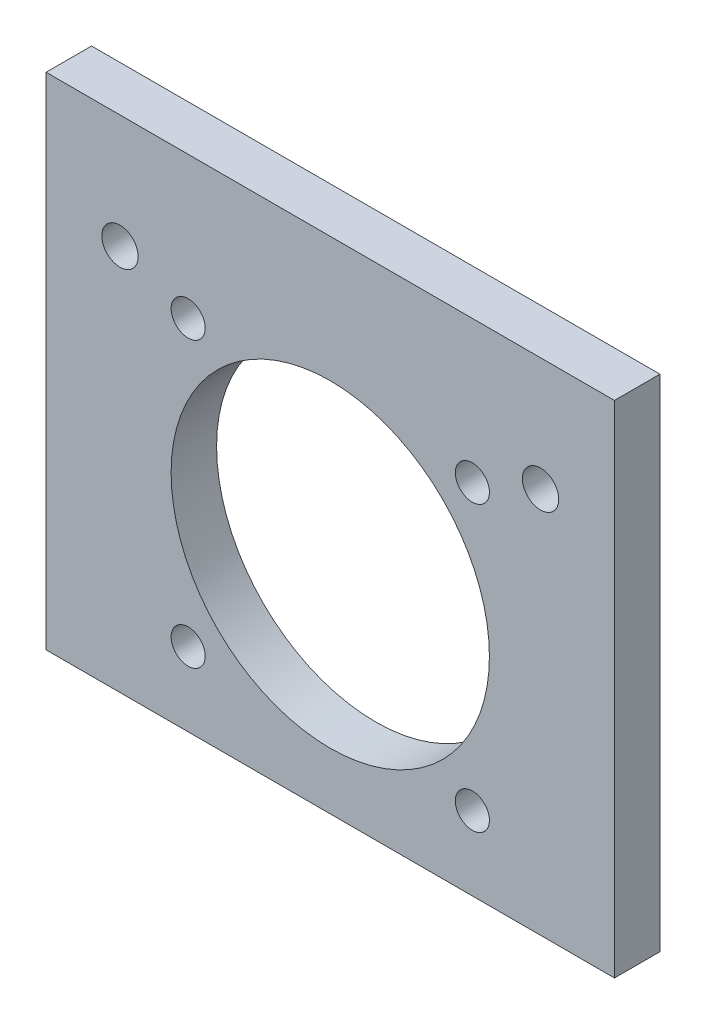
ISO-10303-21;
HEADER;
FILE_DESCRIPTION(('STEP AP214'),'2;1');
FILE_NAME('part.step','',(''),(''),'','','');
FILE_SCHEMA(('AUTOMOTIVE_DESIGN { 1 0 10303 214 1 1 1 1 }'));
ENDSEC;
DATA;
#1=APPLICATION_CONTEXT('core data for automotive mechanical design processes');
#2=APPLICATION_PROTOCOL_DEFINITION('international standard','automotive_design',2000,#1);
#3=PRODUCT_CONTEXT('',#1,'mechanical');
#4=PRODUCT('Part','Part','',(#3));
#5=PRODUCT_RELATED_PRODUCT_CATEGORY('part','',(#4));
#6=PRODUCT_DEFINITION_FORMATION('','',#4);
#7=PRODUCT_DEFINITION_CONTEXT('part definition',#1,'design');
#8=PRODUCT_DEFINITION('design','',#6,#7);
#9=PRODUCT_DEFINITION_SHAPE('','',#8);
#10=(LENGTH_UNIT() NAMED_UNIT(*) SI_UNIT(.MILLI.,.METRE.));
#11=(NAMED_UNIT(*) PLANE_ANGLE_UNIT() SI_UNIT($,.RADIAN.));
#12=(NAMED_UNIT(*) SI_UNIT($,.STERADIAN.) SOLID_ANGLE_UNIT());
#13=UNCERTAINTY_MEASURE_WITH_UNIT(LENGTH_MEASURE(1.E-05),#10,'distance_accuracy_value','');
#14=(GEOMETRIC_REPRESENTATION_CONTEXT(3) GLOBAL_UNCERTAINTY_ASSIGNED_CONTEXT((#13)) GLOBAL_UNIT_ASSIGNED_CONTEXT((#10,
#11,#12)) REPRESENTATION_CONTEXT('',''));
#15=CARTESIAN_POINT('',(0.,0.,0.));
#16=DIRECTION('',(0.,0.,1.));
#17=DIRECTION('',(1.,0.,0.));
#18=AXIS2_PLACEMENT_3D('',#15,#16,#17);
#19=CARTESIAN_POINT('',(0.,0.,0.));
#20=DIRECTION('',(0.,0.,-1.));
#21=DIRECTION('',(-1.,0.,0.));
#22=AXIS2_PLACEMENT_3D('',#19,#20,#21);
#23=PLANE('',#22);
#24=DIRECTION('',(0.,-1.,0.));
#25=VECTOR('',#24,1.);
#26=CARTESIAN_POINT('',(0.,0.,0.));
#27=LINE('',#26,#25);
#28=CARTESIAN_POINT('',(0.,44.,0.));
#29=VERTEX_POINT('',#28);
#30=CARTESIAN_POINT('',(0.,0.,0.));
#31=VERTEX_POINT('',#30);
#32=EDGE_CURVE('E97',#29,#31,#27,.T.);
#33=ORIENTED_EDGE('',*,*,#32,.F.);
#34=DIRECTION('',(-1.,0.,0.));
#35=VECTOR('',#34,1.);
#36=CARTESIAN_POINT('',(0.,44.,0.));
#37=LINE('',#36,#35);
#38=CARTESIAN_POINT('',(50.,44.,0.));
#39=VERTEX_POINT('',#38);
#40=EDGE_CURVE('E73',#39,#29,#37,.T.);
#41=ORIENTED_EDGE('',*,*,#40,.F.);
#42=DIRECTION('',(0.,1.,0.));
#43=VECTOR('',#42,1.);
#44=CARTESIAN_POINT('',(50.,0.,0.));
#45=LINE('',#44,#43);
#46=CARTESIAN_POINT('',(50.,0.,0.));
#47=VERTEX_POINT('',#46);
#48=EDGE_CURVE('E67',#47,#39,#45,.T.);
#49=ORIENTED_EDGE('',*,*,#48,.F.);
#50=DIRECTION('',(1.,0.,0.));
#51=VECTOR('',#50,1.);
#52=CARTESIAN_POINT('',(0.,0.,0.));
#53=LINE('',#52,#51);
#54=EDGE_CURVE('E89',#31,#47,#53,.T.);
#55=ORIENTED_EDGE('',*,*,#54,.F.);
#56=EDGE_LOOP('',(#33,#41,#49,#55));
#57=FACE_BOUND('',#56,.T.);
#58=CARTESIAN_POINT('',(43.5,34.,0.));
#59=DIRECTION('',(0.,0.,1.));
#60=DIRECTION('',(1.,0.,0.));
#61=AXIS2_PLACEMENT_3D('',#58,#59,#60);
#62=CIRCLE('',#61,1.6);
#63=CARTESIAN_POINT('',(45.1,34.,0.));
#64=VERTEX_POINT('',#63);
#65=EDGE_CURVE('E100',#64,#64,#62,.T.);
#66=ORIENTED_EDGE('',*,*,#65,.T.);
#67=EDGE_LOOP('',(#66));
#68=FACE_BOUND('',#67,.T.);
#69=CARTESIAN_POINT('',(6.5,34.,0.));
#70=DIRECTION('',(0.,0.,1.));
#71=DIRECTION('',(1.,0.,0.));
#72=AXIS2_PLACEMENT_3D('',#69,#70,#71);
#73=CIRCLE('',#72,1.6);
#74=CARTESIAN_POINT('',(8.1,34.,0.));
#75=VERTEX_POINT('',#74);
#76=EDGE_CURVE('E116',#75,#75,#73,.T.);
#77=ORIENTED_EDGE('',*,*,#76,.T.);
#78=EDGE_LOOP('',(#77));
#79=FACE_BOUND('',#78,.T.);
#80=CARTESIAN_POINT('',(25.,19.,0.));
#81=DIRECTION('',(0.,0.,1.));
#82=DIRECTION('',(1.,0.,0.));
#83=AXIS2_PLACEMENT_3D('',#80,#81,#82);
#84=CIRCLE('',#83,14.);
#85=CARTESIAN_POINT('',(39.,19.,0.));
#86=VERTEX_POINT('',#85);
#87=EDGE_CURVE('E122',#86,#86,#84,.T.);
#88=ORIENTED_EDGE('',*,*,#87,.T.);
#89=EDGE_LOOP('',(#88));
#90=FACE_BOUND('',#89,.T.);
#91=CARTESIAN_POINT('',(12.4999999999999,6.50000000000013,0.));
#92=DIRECTION('',(0.,0.,1.));
#93=DIRECTION('',(1.,0.,0.));
#94=AXIS2_PLACEMENT_3D('',#91,#92,#93);
#95=CIRCLE('',#94,1.5);
#96=CARTESIAN_POINT('',(13.9999999999999,6.50000000000013,0.));
#97=VERTEX_POINT('',#96);
#98=EDGE_CURVE('E126',#97,#97,#95,.T.);
#99=ORIENTED_EDGE('',*,*,#98,.T.);
#100=EDGE_LOOP('',(#99));
#101=FACE_BOUND('',#100,.T.);
#102=CARTESIAN_POINT('',(37.4999999999999,6.49999999999992,0.));
#103=DIRECTION('',(0.,0.,1.));
#104=DIRECTION('',(1.,0.,0.));
#105=AXIS2_PLACEMENT_3D('',#102,#103,#104);
#106=CIRCLE('',#105,1.49999999999999);
#107=CARTESIAN_POINT('',(38.9999999999999,6.49999999999992,0.));
#108=VERTEX_POINT('',#107);
#109=EDGE_CURVE('E134',#108,#108,#106,.T.);
#110=ORIENTED_EDGE('',*,*,#109,.T.);
#111=EDGE_LOOP('',(#110));
#112=FACE_BOUND('',#111,.T.);
#113=CARTESIAN_POINT('',(37.5,31.5,0.));
#114=DIRECTION('',(0.,0.,1.));
#115=DIRECTION('',(1.,0.,0.));
#116=AXIS2_PLACEMENT_3D('',#113,#114,#115);
#117=CIRCLE('',#116,1.49999999999999);
#118=CARTESIAN_POINT('',(39.,31.5,0.));
#119=VERTEX_POINT('',#118);
#120=EDGE_CURVE('E140',#119,#119,#117,.T.);
#121=ORIENTED_EDGE('',*,*,#120,.T.);
#122=EDGE_LOOP('',(#121));
#123=FACE_BOUND('',#122,.T.);
#124=CARTESIAN_POINT('',(12.5,31.5,0.));
#125=DIRECTION('',(0.,0.,1.));
#126=DIRECTION('',(1.,0.,0.));
#127=AXIS2_PLACEMENT_3D('',#124,#125,#126);
#128=CIRCLE('',#127,1.5);
#129=CARTESIAN_POINT('',(14.,31.5,0.));
#130=VERTEX_POINT('',#129);
#131=EDGE_CURVE('E146',#130,#130,#128,.T.);
#132=ORIENTED_EDGE('',*,*,#131,.T.);
#133=EDGE_LOOP('',(#132));
#134=FACE_BOUND('',#133,.T.);
#135=ADVANCED_FACE('F33',(#57,#68,#79,#90,#101,#112,#123,#134),#23,.T.);
#136=CARTESIAN_POINT('',(0.,0.,4.));
#137=DIRECTION('',(1.,0.,0.));
#138=DIRECTION('',(0.,0.,-1.));
#139=AXIS2_PLACEMENT_3D('',#136,#137,#138);
#140=PLANE('',#139);
#141=ORIENTED_EDGE('',*,*,#32,.T.);
#142=DIRECTION('',(0.,0.,-1.));
#143=VECTOR('',#142,1.);
#144=CARTESIAN_POINT('',(0.,0.,4.));
#145=LINE('',#144,#143);
#146=CARTESIAN_POINT('',(0.,0.,4.));
#147=VERTEX_POINT('',#146);
#148=EDGE_CURVE('E11',#147,#31,#145,.T.);
#149=ORIENTED_EDGE('',*,*,#148,.F.);
#150=DIRECTION('',(0.,-1.,0.));
#151=VECTOR('',#150,1.);
#152=CARTESIAN_POINT('',(0.,0.,4.));
#153=LINE('',#152,#151);
#154=CARTESIAN_POINT('',(0.,44.,4.));
#155=VERTEX_POINT('',#154);
#156=EDGE_CURVE('E85',#155,#147,#153,.T.);
#157=ORIENTED_EDGE('',*,*,#156,.F.);
#158=DIRECTION('',(0.,0.,-1.));
#159=VECTOR('',#158,1.);
#160=CARTESIAN_POINT('',(0.,44.,4.));
#161=LINE('',#160,#159);
#162=EDGE_CURVE('E93',#155,#29,#161,.T.);
#163=ORIENTED_EDGE('',*,*,#162,.T.);
#164=EDGE_LOOP('',(#141,#149,#157,#163));
#165=FACE_BOUND('',#164,.T.);
#166=ADVANCED_FACE('F35',(#165),#140,.F.);
#167=CARTESIAN_POINT('',(0.,0.,4.));
#168=DIRECTION('',(0.,1.,0.));
#169=DIRECTION('',(0.,0.,1.));
#170=AXIS2_PLACEMENT_3D('',#167,#168,#169);
#171=PLANE('',#170);
#172=ORIENTED_EDGE('',*,*,#54,.T.);
#173=DIRECTION('',(0.,0.,-1.));
#174=VECTOR('',#173,1.);
#175=CARTESIAN_POINT('',(50.,0.,4.));
#176=LINE('',#175,#174);
#177=CARTESIAN_POINT('',(50.,0.,4.));
#178=VERTEX_POINT('',#177);
#179=EDGE_CURVE('E42',#178,#47,#176,.T.);
#180=ORIENTED_EDGE('',*,*,#179,.F.);
#181=DIRECTION('',(1.,0.,0.));
#182=VECTOR('',#181,1.);
#183=CARTESIAN_POINT('',(0.,0.,4.));
#184=LINE('',#183,#182);
#185=EDGE_CURVE('E80',#147,#178,#184,.T.);
#186=ORIENTED_EDGE('',*,*,#185,.F.);
#187=ORIENTED_EDGE('',*,*,#148,.T.);
#188=EDGE_LOOP('',(#172,#180,#186,#187));
#189=FACE_BOUND('',#188,.T.);
#190=ADVANCED_FACE('F88',(#189),#171,.F.);
#191=CARTESIAN_POINT('',(50.,0.,4.));
#192=DIRECTION('',(-1.,0.,0.));
#193=DIRECTION('',(0.,0.,1.));
#194=AXIS2_PLACEMENT_3D('',#191,#192,#193);
#195=PLANE('',#194);
#196=ORIENTED_EDGE('',*,*,#48,.T.);
#197=DIRECTION('',(0.,0.,-1.));
#198=VECTOR('',#197,1.);
#199=CARTESIAN_POINT('',(50.,44.,4.));
#200=LINE('',#199,#198);
#201=CARTESIAN_POINT('',(50.,44.,4.));
#202=VERTEX_POINT('',#201);
#203=EDGE_CURVE('E90',#202,#39,#200,.T.);
#204=ORIENTED_EDGE('',*,*,#203,.F.);
#205=DIRECTION('',(0.,1.,0.));
#206=VECTOR('',#205,1.);
#207=CARTESIAN_POINT('',(50.,0.,4.));
#208=LINE('',#207,#206);
#209=EDGE_CURVE('E83',#178,#202,#208,.T.);
#210=ORIENTED_EDGE('',*,*,#209,.F.);
#211=ORIENTED_EDGE('',*,*,#179,.T.);
#212=EDGE_LOOP('',(#196,#204,#210,#211));
#213=FACE_BOUND('',#212,.T.);
#214=ADVANCED_FACE('F91',(#213),#195,.F.);
#215=CARTESIAN_POINT('',(0.,44.,4.));
#216=DIRECTION('',(0.,-1.,0.));
#217=DIRECTION('',(0.,0.,-1.));
#218=AXIS2_PLACEMENT_3D('',#215,#216,#217);
#219=PLANE('',#218);
#220=ORIENTED_EDGE('',*,*,#40,.T.);
#221=ORIENTED_EDGE('',*,*,#162,.F.);
#222=DIRECTION('',(-1.,0.,0.));
#223=VECTOR('',#222,1.);
#224=CARTESIAN_POINT('',(0.,44.,4.));
#225=LINE('',#224,#223);
#226=EDGE_CURVE('E50',#202,#155,#225,.T.);
#227=ORIENTED_EDGE('',*,*,#226,.F.);
#228=ORIENTED_EDGE('',*,*,#203,.T.);
#229=EDGE_LOOP('',(#220,#221,#227,#228));
#230=FACE_BOUND('',#229,.T.);
#231=ADVANCED_FACE('F105',(#230),#219,.F.);
#232=CARTESIAN_POINT('',(0.,0.,4.));
#233=DIRECTION('',(0.,0.,-1.));
#234=DIRECTION('',(-1.,0.,0.));
#235=AXIS2_PLACEMENT_3D('',#232,#233,#234);
#236=PLANE('',#235);
#237=CARTESIAN_POINT('',(12.5,31.5,4.));
#238=DIRECTION('',(0.,0.,1.));
#239=DIRECTION('',(1.,0.,0.));
#240=AXIS2_PLACEMENT_3D('',#237,#238,#239);
#241=CIRCLE('',#240,1.5);
#242=CARTESIAN_POINT('',(14.,31.5,4.));
#243=VERTEX_POINT('',#242);
#244=EDGE_CURVE('E149',#243,#243,#241,.T.);
#245=ORIENTED_EDGE('',*,*,#244,.F.);
#246=EDGE_LOOP('',(#245));
#247=FACE_BOUND('',#246,.T.);
#248=CARTESIAN_POINT('',(37.5,31.5,4.));
#249=DIRECTION('',(0.,0.,1.));
#250=DIRECTION('',(1.,0.,0.));
#251=AXIS2_PLACEMENT_3D('',#248,#249,#250);
#252=CIRCLE('',#251,1.49999999999999);
#253=CARTESIAN_POINT('',(39.,31.5,4.));
#254=VERTEX_POINT('',#253);
#255=EDGE_CURVE('E143',#254,#254,#252,.T.);
#256=ORIENTED_EDGE('',*,*,#255,.F.);
#257=EDGE_LOOP('',(#256));
#258=FACE_BOUND('',#257,.T.);
#259=CARTESIAN_POINT('',(37.4999999999999,6.49999999999992,4.));
#260=DIRECTION('',(0.,0.,1.));
#261=DIRECTION('',(1.,0.,0.));
#262=AXIS2_PLACEMENT_3D('',#259,#260,#261);
#263=CIRCLE('',#262,1.49999999999999);
#264=CARTESIAN_POINT('',(38.9999999999999,6.49999999999992,4.));
#265=VERTEX_POINT('',#264);
#266=EDGE_CURVE('E137',#265,#265,#263,.T.);
#267=ORIENTED_EDGE('',*,*,#266,.F.);
#268=EDGE_LOOP('',(#267));
#269=FACE_BOUND('',#268,.T.);
#270=CARTESIAN_POINT('',(12.4999999999999,6.50000000000013,4.));
#271=DIRECTION('',(0.,0.,1.));
#272=DIRECTION('',(1.,0.,0.));
#273=AXIS2_PLACEMENT_3D('',#270,#271,#272);
#274=CIRCLE('',#273,1.5);
#275=CARTESIAN_POINT('',(13.9999999999999,6.50000000000013,4.));
#276=VERTEX_POINT('',#275);
#277=EDGE_CURVE('E131',#276,#276,#274,.T.);
#278=ORIENTED_EDGE('',*,*,#277,.F.);
#279=EDGE_LOOP('',(#278));
#280=FACE_BOUND('',#279,.T.);
#281=CARTESIAN_POINT('',(25.,19.,4.));
#282=DIRECTION('',(0.,0.,1.));
#283=DIRECTION('',(1.,0.,0.));
#284=AXIS2_PLACEMENT_3D('',#281,#282,#283);
#285=CIRCLE('',#284,14.);
#286=CARTESIAN_POINT('',(39.,19.,4.));
#287=VERTEX_POINT('',#286);
#288=EDGE_CURVE('E123',#287,#287,#285,.T.);
#289=ORIENTED_EDGE('',*,*,#288,.F.);
#290=EDGE_LOOP('',(#289));
#291=FACE_BOUND('',#290,.T.);
#292=CARTESIAN_POINT('',(6.5,34.,4.));
#293=DIRECTION('',(0.,0.,1.));
#294=DIRECTION('',(1.,0.,0.));
#295=AXIS2_PLACEMENT_3D('',#292,#293,#294);
#296=CIRCLE('',#295,1.59999999999999);
#297=CARTESIAN_POINT('',(8.09999999999999,34.,4.));
#298=VERTEX_POINT('',#297);
#299=EDGE_CURVE('E119',#298,#298,#296,.T.);
#300=ORIENTED_EDGE('',*,*,#299,.F.);
#301=EDGE_LOOP('',(#300));
#302=FACE_BOUND('',#301,.T.);
#303=CARTESIAN_POINT('',(43.5,34.,4.));
#304=DIRECTION('',(0.,0.,1.));
#305=DIRECTION('',(1.,0.,0.));
#306=AXIS2_PLACEMENT_3D('',#303,#304,#305);
#307=CIRCLE('',#306,1.59999999999999);
#308=CARTESIAN_POINT('',(45.1,34.,4.));
#309=VERTEX_POINT('',#308);
#310=EDGE_CURVE('E113',#309,#309,#307,.T.);
#311=ORIENTED_EDGE('',*,*,#310,.F.);
#312=EDGE_LOOP('',(#311));
#313=FACE_BOUND('',#312,.T.);
#314=ORIENTED_EDGE('',*,*,#156,.T.);
#315=ORIENTED_EDGE('',*,*,#185,.T.);
#316=ORIENTED_EDGE('',*,*,#209,.T.);
#317=ORIENTED_EDGE('',*,*,#226,.T.);
#318=EDGE_LOOP('',(#314,#315,#316,#317));
#319=FACE_BOUND('',#318,.T.);
#320=ADVANCED_FACE('F81',(#247,#258,#269,#280,#291,#302,#313,#319),#236,.F.);
#321=CARTESIAN_POINT('',(43.5,34.,4.));
#322=DIRECTION('',(0.,0.,1.));
#323=DIRECTION('',(1.,0.,0.));
#324=AXIS2_PLACEMENT_3D('',#321,#322,#323);
#325=CYLINDRICAL_SURFACE('',#324,1.59999999999999);
#326=ORIENTED_EDGE('',*,*,#65,.F.);
#327=EDGE_LOOP('',(#326));
#328=FACE_BOUND('',#327,.T.);
#329=ORIENTED_EDGE('',*,*,#310,.T.);
#330=EDGE_LOOP('',(#329));
#331=FACE_BOUND('',#330,.T.);
#332=ADVANCED_FACE('F157',(#328,#331),#325,.F.);
#333=CARTESIAN_POINT('',(6.5,34.,4.));
#334=DIRECTION('',(0.,0.,1.));
#335=DIRECTION('',(1.,0.,0.));
#336=AXIS2_PLACEMENT_3D('',#333,#334,#335);
#337=CYLINDRICAL_SURFACE('',#336,1.59999999999999);
#338=ORIENTED_EDGE('',*,*,#76,.F.);
#339=EDGE_LOOP('',(#338));
#340=FACE_BOUND('',#339,.T.);
#341=ORIENTED_EDGE('',*,*,#299,.T.);
#342=EDGE_LOOP('',(#341));
#343=FACE_BOUND('',#342,.T.);
#344=ADVANCED_FACE('F172',(#340,#343),#337,.F.);
#345=CARTESIAN_POINT('',(25.,19.,0.));
#346=DIRECTION('',(0.,0.,1.));
#347=DIRECTION('',(1.,0.,0.));
#348=AXIS2_PLACEMENT_3D('',#345,#346,#347);
#349=CYLINDRICAL_SURFACE('',#348,14.);
#350=ORIENTED_EDGE('',*,*,#87,.F.);
#351=EDGE_LOOP('',(#350));
#352=FACE_BOUND('',#351,.T.);
#353=ORIENTED_EDGE('',*,*,#288,.T.);
#354=EDGE_LOOP('',(#353));
#355=FACE_BOUND('',#354,.T.);
#356=ADVANCED_FACE('F178',(#352,#355),#349,.F.);
#357=CARTESIAN_POINT('',(12.4999999999999,6.50000000000013,4.));
#358=DIRECTION('',(0.,0.,1.));
#359=DIRECTION('',(1.,0.,0.));
#360=AXIS2_PLACEMENT_3D('',#357,#358,#359);
#361=CYLINDRICAL_SURFACE('',#360,1.5);
#362=ORIENTED_EDGE('',*,*,#98,.F.);
#363=EDGE_LOOP('',(#362));
#364=FACE_BOUND('',#363,.T.);
#365=ORIENTED_EDGE('',*,*,#277,.T.);
#366=EDGE_LOOP('',(#365));
#367=FACE_BOUND('',#366,.T.);
#368=ADVANCED_FACE('F217',(#364,#367),#361,.F.);
#369=CARTESIAN_POINT('',(37.4999999999999,6.49999999999992,4.));
#370=DIRECTION('',(0.,0.,1.));
#371=DIRECTION('',(1.,0.,0.));
#372=AXIS2_PLACEMENT_3D('',#369,#370,#371);
#373=CYLINDRICAL_SURFACE('',#372,1.49999999999999);
#374=ORIENTED_EDGE('',*,*,#109,.F.);
#375=EDGE_LOOP('',(#374));
#376=FACE_BOUND('',#375,.T.);
#377=ORIENTED_EDGE('',*,*,#266,.T.);
#378=EDGE_LOOP('',(#377));
#379=FACE_BOUND('',#378,.T.);
#380=ADVANCED_FACE('F222',(#376,#379),#373,.F.);
#381=CARTESIAN_POINT('',(37.5,31.5,4.));
#382=DIRECTION('',(0.,0.,1.));
#383=DIRECTION('',(1.,0.,0.));
#384=AXIS2_PLACEMENT_3D('',#381,#382,#383);
#385=CYLINDRICAL_SURFACE('',#384,1.49999999999999);
#386=ORIENTED_EDGE('',*,*,#120,.F.);
#387=EDGE_LOOP('',(#386));
#388=FACE_BOUND('',#387,.T.);
#389=ORIENTED_EDGE('',*,*,#255,.T.);
#390=EDGE_LOOP('',(#389));
#391=FACE_BOUND('',#390,.T.);
#392=ADVANCED_FACE('F233',(#388,#391),#385,.F.);
#393=CARTESIAN_POINT('',(12.5,31.5,4.));
#394=DIRECTION('',(0.,0.,1.));
#395=DIRECTION('',(1.,0.,0.));
#396=AXIS2_PLACEMENT_3D('',#393,#394,#395);
#397=CYLINDRICAL_SURFACE('',#396,1.5);
#398=ORIENTED_EDGE('',*,*,#131,.F.);
#399=EDGE_LOOP('',(#398));
#400=FACE_BOUND('',#399,.T.);
#401=ORIENTED_EDGE('',*,*,#244,.T.);
#402=EDGE_LOOP('',(#401));
#403=FACE_BOUND('',#402,.T.);
#404=ADVANCED_FACE('F153',(#400,#403),#397,.F.);
#405=CLOSED_SHELL('',(#135,#166,#190,#214,#231,#320,#332,#344,#356,#368,#380,#392,#404));
#406=MANIFOLD_SOLID_BREP('B2',#405);
#407=ADVANCED_BREP_SHAPE_REPRESENTATION('',(#18,#406),#14);
#408=SHAPE_DEFINITION_REPRESENTATION(#9,#407);
ENDSEC;
END-ISO-10303-21;
